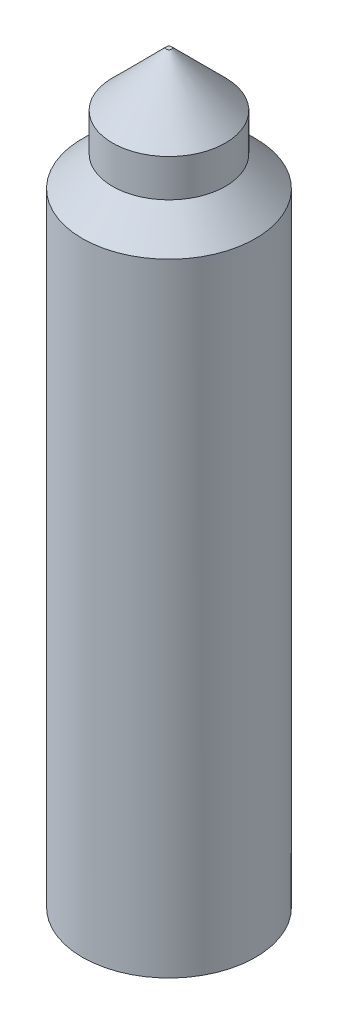
ISO-10303-21;
HEADER;
FILE_DESCRIPTION(('STEP AP214'),'2;1');
FILE_NAME('part.step','',(''),(''),'','','');
FILE_SCHEMA(('AUTOMOTIVE_DESIGN { 1 0 10303 214 1 1 1 1 }'));
ENDSEC;
DATA;
#1=APPLICATION_CONTEXT('core data for automotive mechanical design processes');
#2=APPLICATION_PROTOCOL_DEFINITION('international standard','automotive_design',2000,#1);
#3=PRODUCT_CONTEXT('',#1,'mechanical');
#4=PRODUCT('Part','Part','',(#3));
#5=PRODUCT_RELATED_PRODUCT_CATEGORY('part','',(#4));
#6=PRODUCT_DEFINITION_FORMATION('','',#4);
#7=PRODUCT_DEFINITION_CONTEXT('part definition',#1,'design');
#8=PRODUCT_DEFINITION('design','',#6,#7);
#9=PRODUCT_DEFINITION_SHAPE('','',#8);
#10=(LENGTH_UNIT() NAMED_UNIT(*) SI_UNIT(.MILLI.,.METRE.));
#11=(NAMED_UNIT(*) PLANE_ANGLE_UNIT() SI_UNIT($,.RADIAN.));
#12=(NAMED_UNIT(*) SI_UNIT($,.STERADIAN.) SOLID_ANGLE_UNIT());
#13=UNCERTAINTY_MEASURE_WITH_UNIT(LENGTH_MEASURE(1.E-05),#10,'distance_accuracy_value','');
#14=(GEOMETRIC_REPRESENTATION_CONTEXT(3) GLOBAL_UNCERTAINTY_ASSIGNED_CONTEXT((#13)) GLOBAL_UNIT_ASSIGNED_CONTEXT((#10,
#11,#12)) REPRESENTATION_CONTEXT('',''));
#15=CARTESIAN_POINT('',(0.,0.,0.));
#16=DIRECTION('',(0.,0.,1.));
#17=DIRECTION('',(1.,0.,0.));
#18=AXIS2_PLACEMENT_3D('',#15,#16,#17);
#19=CARTESIAN_POINT('',(0.,100.,0.));
#20=DIRECTION('',(0.,-1.,0.));
#21=DIRECTION('',(0.,0.,-1.));
#22=AXIS2_PLACEMENT_3D('',#19,#20,#21);
#23=CYLINDRICAL_SURFACE('',#22,12.8);
#24=CARTESIAN_POINT('',(0.,91.9999999999999,0.));
#25=DIRECTION('',(0.,1.,0.));
#26=DIRECTION('',(0.,0.,1.));
#27=AXIS2_PLACEMENT_3D('',#24,#25,#26);
#28=CIRCLE('',#27,12.8);
#29=CARTESIAN_POINT('',(0.,91.9999999999999,12.8));
#30=VERTEX_POINT('',#29);
#31=EDGE_CURVE('E62',#30,#30,#28,.F.);
#32=ORIENTED_EDGE('',*,*,#31,.T.);
#33=EDGE_LOOP('',(#32));
#34=FACE_BOUND('',#33,.T.);
#35=CARTESIAN_POINT('',(0.,0.,0.));
#36=DIRECTION('',(0.,1.,0.));
#37=DIRECTION('',(0.,0.,1.));
#38=AXIS2_PLACEMENT_3D('',#35,#36,#37);
#39=CIRCLE('',#38,12.8);
#40=CARTESIAN_POINT('',(0.,0.,12.8));
#41=VERTEX_POINT('',#40);
#42=EDGE_CURVE('E78',#41,#41,#39,.T.);
#43=ORIENTED_EDGE('',*,*,#42,.T.);
#44=EDGE_LOOP('',(#43));
#45=FACE_BOUND('',#44,.T.);
#46=ADVANCED_FACE('F53',(#34,#45),#23,.T.);
#47=CARTESIAN_POINT('',(0.,0.,0.));
#48=DIRECTION('',(0.,1.,0.));
#49=DIRECTION('',(0.,0.,1.));
#50=AXIS2_PLACEMENT_3D('',#47,#48,#49);
#51=PLANE('',#50);
#52=ORIENTED_EDGE('',*,*,#42,.F.);
#53=EDGE_LOOP('',(#52));
#54=FACE_BOUND('',#53,.T.);
#55=ADVANCED_FACE('F84',(#54),#51,.F.);
#56=CARTESIAN_POINT('',(0.,110.,0.));
#57=DIRECTION('',(0.,-1.,0.));
#58=DIRECTION('',(0.,0.,-1.));
#59=AXIS2_PLACEMENT_3D('',#56,#57,#58);
#60=CYLINDRICAL_SURFACE('',#59,8.34876404566843);
#61=CARTESIAN_POINT('',(0.,96.4512359543314,0.));
#62=DIRECTION('',(0.,-1.,0.));
#63=DIRECTION('',(0.,0.,-1.));
#64=AXIS2_PLACEMENT_3D('',#61,#62,#63);
#65=CIRCLE('',#64,8.34876404566843);
#66=CARTESIAN_POINT('',(0.,96.4512359543314,-8.34876404566843));
#67=VERTEX_POINT('',#66);
#68=EDGE_CURVE('E10',#67,#67,#65,.F.);
#69=ORIENTED_EDGE('',*,*,#68,.T.);
#70=EDGE_LOOP('',(#69));
#71=FACE_BOUND('',#70,.T.);
#72=CARTESIAN_POINT('',(0.,102.,0.));
#73=DIRECTION('',(0.,1.,0.));
#74=DIRECTION('',(0.,0.,1.));
#75=AXIS2_PLACEMENT_3D('',#72,#73,#74);
#76=CIRCLE('',#75,8.34876404566843);
#77=CARTESIAN_POINT('',(0.,102.,-8.34876404566844));
#78=VERTEX_POINT('',#77);
#79=EDGE_CURVE('E67',#78,#78,#76,.F.);
#80=ORIENTED_EDGE('',*,*,#79,.T.);
#81=EDGE_LOOP('',(#80));
#82=FACE_BOUND('',#81,.T.);
#83=ADVANCED_FACE('F86',(#71,#82),#60,.T.);
#84=CARTESIAN_POINT('',(0.,110.,0.));
#85=DIRECTION('',(0.,1.,0.));
#86=DIRECTION('',(0.,0.,1.));
#87=AXIS2_PLACEMENT_3D('',#84,#85,#86);
#88=PLANE('',#87);
#89=CARTESIAN_POINT('',(0.,110.,0.));
#90=DIRECTION('',(0.,1.,0.));
#91=DIRECTION('',(0.,0.,1.));
#92=AXIS2_PLACEMENT_3D('',#89,#90,#91);
#93=CIRCLE('',#92,0.348764045668429);
#94=CARTESIAN_POINT('',(0.,110.,-0.348764045668436));
#95=VERTEX_POINT('',#94);
#96=EDGE_CURVE('E72',#95,#95,#93,.T.);
#97=ORIENTED_EDGE('',*,*,#96,.T.);
#98=EDGE_LOOP('',(#97));
#99=FACE_BOUND('',#98,.T.);
#100=ADVANCED_FACE('F92',(#99),#88,.T.);
#101=CARTESIAN_POINT('',(0.,110.,0.));
#102=DIRECTION('',(0.,-1.,0.));
#103=DIRECTION('',(0.,0.,-1.));
#104=AXIS2_PLACEMENT_3D('',#101,#102,#103);
#105=CONICAL_SURFACE('',#104,0.348764045668429,0.785398163397447);
#106=CARTESIAN_POINT('',(0.,102.,-8.34876404566844));
#107=CARTESIAN_POINT('',(0.,102.083333333333,-8.2654307123351));
#108=CARTESIAN_POINT('',(0.,102.166666666667,-8.18209737900177));
#109=CARTESIAN_POINT('',(0.,102.333333333333,-8.0154307123351));
#110=CARTESIAN_POINT('',(0.,102.416666666667,-7.93209737900177));
#111=CARTESIAN_POINT('',(0.,102.583333333333,-7.7654307123351));
#112=CARTESIAN_POINT('',(0.,102.666666666667,-7.68209737900177));
#113=CARTESIAN_POINT('',(0.,102.833333333333,-7.5154307123351));
#114=CARTESIAN_POINT('',(0.,102.916666666667,-7.43209737900177));
#115=CARTESIAN_POINT('',(0.,103.083333333333,-7.2654307123351));
#116=CARTESIAN_POINT('',(0.,103.166666666667,-7.18209737900177));
#117=CARTESIAN_POINT('',(0.,103.333333333333,-7.0154307123351));
#118=CARTESIAN_POINT('',(0.,103.416666666667,-6.93209737900177));
#119=CARTESIAN_POINT('',(0.,103.583333333333,-6.7654307123351));
#120=CARTESIAN_POINT('',(0.,103.666666666667,-6.68209737900177));
#121=CARTESIAN_POINT('',(0.,103.833333333333,-6.5154307123351));
#122=CARTESIAN_POINT('',(0.,103.916666666667,-6.43209737900177));
#123=CARTESIAN_POINT('',(0.,104.083333333333,-6.2654307123351));
#124=CARTESIAN_POINT('',(0.,104.166666666667,-6.18209737900177));
#125=CARTESIAN_POINT('',(0.,104.333333333333,-6.0154307123351));
#126=CARTESIAN_POINT('',(0.,104.416666666667,-5.93209737900177));
#127=CARTESIAN_POINT('',(0.,104.583333333333,-5.7654307123351));
#128=CARTESIAN_POINT('',(0.,104.666666666667,-5.68209737900177));
#129=CARTESIAN_POINT('',(0.,104.833333333333,-5.5154307123351));
#130=CARTESIAN_POINT('',(0.,104.916666666667,-5.43209737900177));
#131=CARTESIAN_POINT('',(0.,105.083333333333,-5.2654307123351));
#132=CARTESIAN_POINT('',(0.,105.166666666667,-5.18209737900177));
#133=CARTESIAN_POINT('',(0.,105.333333333333,-5.0154307123351));
#134=CARTESIAN_POINT('',(0.,105.416666666667,-4.93209737900177));
#135=CARTESIAN_POINT('',(0.,105.583333333333,-4.7654307123351));
#136=CARTESIAN_POINT('',(0.,105.666666666667,-4.68209737900177));
#137=CARTESIAN_POINT('',(0.,105.833333333333,-4.5154307123351));
#138=CARTESIAN_POINT('',(0.,105.916666666667,-4.43209737900177));
#139=CARTESIAN_POINT('',(0.,106.083333333333,-4.2654307123351));
#140=CARTESIAN_POINT('',(0.,106.166666666667,-4.18209737900177));
#141=CARTESIAN_POINT('',(0.,106.333333333333,-4.0154307123351));
#142=CARTESIAN_POINT('',(0.,106.416666666667,-3.93209737900177));
#143=CARTESIAN_POINT('',(0.,106.583333333333,-3.7654307123351));
#144=CARTESIAN_POINT('',(0.,106.666666666667,-3.68209737900177));
#145=CARTESIAN_POINT('',(0.,106.833333333333,-3.5154307123351));
#146=CARTESIAN_POINT('',(0.,106.916666666667,-3.43209737900177));
#147=CARTESIAN_POINT('',(0.,107.083333333333,-3.2654307123351));
#148=CARTESIAN_POINT('',(0.,107.166666666667,-3.18209737900177));
#149=CARTESIAN_POINT('',(0.,107.333333333333,-3.0154307123351));
#150=CARTESIAN_POINT('',(0.,107.416666666667,-2.93209737900177));
#151=CARTESIAN_POINT('',(0.,107.583333333333,-2.7654307123351));
#152=CARTESIAN_POINT('',(0.,107.666666666667,-2.68209737900177));
#153=CARTESIAN_POINT('',(0.,107.833333333333,-2.5154307123351));
#154=CARTESIAN_POINT('',(0.,107.916666666667,-2.43209737900177));
#155=CARTESIAN_POINT('',(0.,108.083333333333,-2.2654307123351));
#156=CARTESIAN_POINT('',(0.,108.166666666667,-2.18209737900177));
#157=CARTESIAN_POINT('',(0.,108.333333333333,-2.0154307123351));
#158=CARTESIAN_POINT('',(0.,108.416666666667,-1.93209737900177));
#159=CARTESIAN_POINT('',(0.,108.583333333333,-1.7654307123351));
#160=CARTESIAN_POINT('',(0.,108.666666666667,-1.68209737900177));
#161=CARTESIAN_POINT('',(0.,108.833333333333,-1.5154307123351));
#162=CARTESIAN_POINT('',(0.,108.916666666667,-1.43209737900177));
#163=CARTESIAN_POINT('',(0.,109.083333333333,-1.2654307123351));
#164=CARTESIAN_POINT('',(0.,109.166666666667,-1.18209737900177));
#165=CARTESIAN_POINT('',(0.,109.333333333333,-1.0154307123351));
#166=CARTESIAN_POINT('',(0.,109.416666666667,-0.932097379001769));
#167=CARTESIAN_POINT('',(0.,109.583333333333,-0.765430712335102));
#168=CARTESIAN_POINT('',(0.,109.666666666667,-0.682097379001769));
#169=CARTESIAN_POINT('',(0.,109.833333333333,-0.515430712335102));
#170=CARTESIAN_POINT('',(0.,109.916666666667,-0.432097379001769));
#171=CARTESIAN_POINT('',(0.,110.,-0.348764045668436));
#172=B_SPLINE_CURVE_WITH_KNOTS('',3,(#106,#107,#108,#109,#110,#111,#112,#113,#114,#115,#116,
#117,#118,#119,#120,#121,#122,#123,#124,#125,#126,#127,#128,#129,#130,#131,#132,#133,#134,#135,
#136,#137,#138,#139,#140,#141,#142,#143,#144,#145,#146,#147,#148,#149,#150,#151,#152,#153,#154,
#155,#156,#157,#158,#159,#160,#161,#162,#163,#164,#165,#166,#167,#168,#169,#170,#171),
.UNSPECIFIED.,.F.,.F.,(4,2,2,2,2,2,2,2,2,2,2,2,2,2,2,2,2,2,2,2,2,2,2,2,2,2,2,2,2,2,2,2,4),(0.,
0.353553390593274,0.707106781186548,1.06066017177982,1.4142135623731,1.76776695296637,
2.12132034355964,2.47487373415292,2.82842712474619,3.18198051533947,3.53553390593274,
3.88908729652601,4.24264068711929,4.59619407771256,4.94974746830584,5.30330085889911,
5.65685424949238,6.01040764008566,6.36396103067893,6.71751442127221,7.07106781186548,
7.42462120245875,7.77817459305203,8.1317279836453,8.48528137423858,8.83883476483185,
9.19238815542512,9.5459415460184,9.89949493661167,10.2530483272049,10.6066017177982,
10.9601551083915,11.3137084989848),.UNSPECIFIED.);
#173=EDGE_CURVE('BSEAM97',#78,#95,#172,.T.);
#174=ORIENTED_EDGE('',*,*,#79,.F.);
#175=ORIENTED_EDGE('',*,*,#96,.F.);
#176=ORIENTED_EDGE('',*,*,#173,.T.);
#177=ORIENTED_EDGE('',*,*,#173,.F.);
#178=EDGE_LOOP('',(#174,#176,#175,#177));
#179=FACE_BOUND('',#178,.T.);
#180=ADVANCED_FACE('F97',(#179),#105,.T.);
#181=CARTESIAN_POINT('',(0.,100.,0.));
#182=DIRECTION('',(0.,-1.,0.));
#183=DIRECTION('',(0.,0.,-1.));
#184=AXIS2_PLACEMENT_3D('',#181,#182,#183);
#185=CONICAL_SURFACE('',#184,4.79999999999984,0.785398163397453);
#186=ORIENTED_EDGE('',*,*,#31,.F.);
#187=EDGE_LOOP('',(#186));
#188=FACE_BOUND('',#187,.T.);
#189=ORIENTED_EDGE('',*,*,#68,.F.);
#190=EDGE_LOOP('',(#189));
#191=FACE_BOUND('',#190,.T.);
#192=ADVANCED_FACE('F56',(#188,#191),#185,.T.);
#193=CLOSED_SHELL('',(#46,#55,#83,#100,#180,#192));
#194=MANIFOLD_SOLID_BREP('B2',#193);
#195=ADVANCED_BREP_SHAPE_REPRESENTATION('',(#18,#194),#14);
#196=SHAPE_DEFINITION_REPRESENTATION(#9,#195);
ENDSEC;
END-ISO-10303-21;
